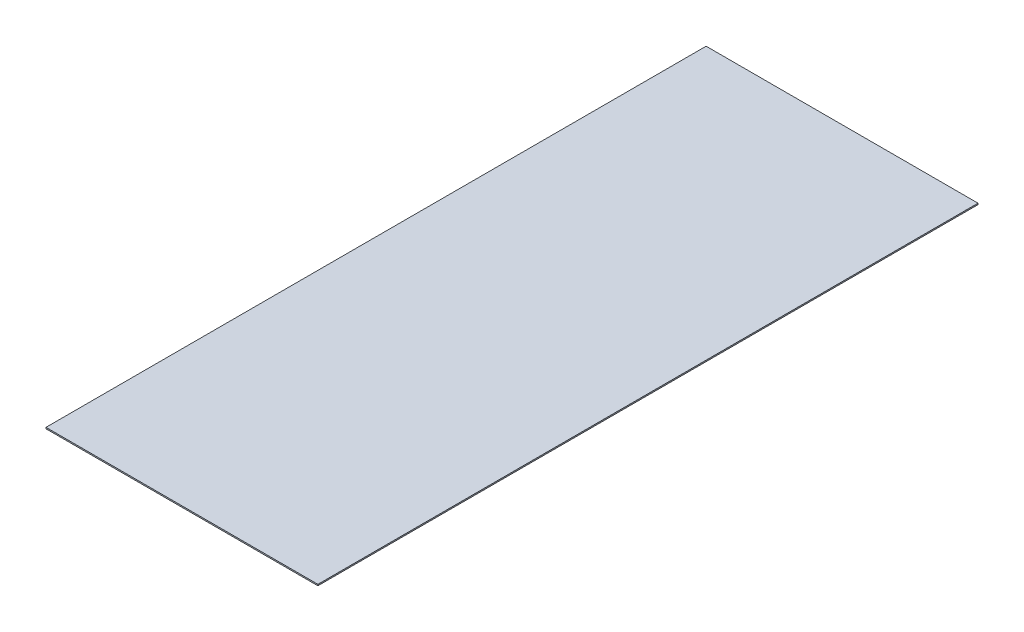
ISO-10303-21;
HEADER;
FILE_DESCRIPTION(('STEP AP214'),'2;1');
FILE_NAME('part.step','',(''),(''),'','','');
FILE_SCHEMA(('AUTOMOTIVE_DESIGN { 1 0 10303 214 1 1 1 1 }'));
ENDSEC;
DATA;
#1=APPLICATION_CONTEXT('core data for automotive mechanical design processes');
#2=APPLICATION_PROTOCOL_DEFINITION('international standard','automotive_design',2000,#1);
#3=PRODUCT_CONTEXT('',#1,'mechanical');
#4=PRODUCT('Part','Part','',(#3));
#5=PRODUCT_RELATED_PRODUCT_CATEGORY('part','',(#4));
#6=PRODUCT_DEFINITION_FORMATION('','',#4);
#7=PRODUCT_DEFINITION_CONTEXT('part definition',#1,'design');
#8=PRODUCT_DEFINITION('design','',#6,#7);
#9=PRODUCT_DEFINITION_SHAPE('','',#8);
#10=(LENGTH_UNIT() NAMED_UNIT(*) SI_UNIT(.MILLI.,.METRE.));
#11=(NAMED_UNIT(*) PLANE_ANGLE_UNIT() SI_UNIT($,.RADIAN.));
#12=(NAMED_UNIT(*) SI_UNIT($,.STERADIAN.) SOLID_ANGLE_UNIT());
#13=UNCERTAINTY_MEASURE_WITH_UNIT(LENGTH_MEASURE(1.E-05),#10,'distance_accuracy_value','');
#14=(GEOMETRIC_REPRESENTATION_CONTEXT(3) GLOBAL_UNCERTAINTY_ASSIGNED_CONTEXT((#13)) GLOBAL_UNIT_ASSIGNED_CONTEXT((#10,
#11,#12)) REPRESENTATION_CONTEXT('',''));
#15=CARTESIAN_POINT('',(0.,0.,0.));
#16=DIRECTION('',(0.,0.,1.));
#17=DIRECTION('',(1.,0.,0.));
#18=AXIS2_PLACEMENT_3D('',#15,#16,#17);
#19=CARTESIAN_POINT('',(-208.,0.999999999999988,1010.));
#20=DIRECTION('',(1.,0.,0.));
#21=DIRECTION('',(0.,0.,-1.));
#22=AXIS2_PLACEMENT_3D('',#19,#20,#21);
#23=PLANE('',#22);
#24=DIRECTION('',(0.,-1.,0.));
#25=VECTOR('',#24,1.);
#26=CARTESIAN_POINT('',(-208.,0.999999999999988,0.));
#27=LINE('',#26,#25);
#28=CARTESIAN_POINT('',(-208.,0.999999999999988,0.));
#29=VERTEX_POINT('',#28);
#30=CARTESIAN_POINT('',(-208.,-1.00000000000001,0.));
#31=VERTEX_POINT('',#30);
#32=EDGE_CURVE('E94',#29,#31,#27,.T.);
#33=ORIENTED_EDGE('',*,*,#32,.T.);
#34=DIRECTION('',(0.,0.,-1.));
#35=VECTOR('',#34,1.);
#36=CARTESIAN_POINT('',(-208.,-1.00000000000001,1010.));
#37=LINE('',#36,#35);
#38=CARTESIAN_POINT('',(-208.,-1.00000000000001,1010.));
#39=VERTEX_POINT('',#38);
#40=EDGE_CURVE('E11',#39,#31,#37,.T.);
#41=ORIENTED_EDGE('',*,*,#40,.F.);
#42=DIRECTION('',(0.,-1.,0.));
#43=VECTOR('',#42,1.);
#44=CARTESIAN_POINT('',(-208.,0.999999999999988,1010.));
#45=LINE('',#44,#43);
#46=CARTESIAN_POINT('',(-208.,0.999999999999988,1010.));
#47=VERTEX_POINT('',#46);
#48=EDGE_CURVE('E82',#47,#39,#45,.T.);
#49=ORIENTED_EDGE('',*,*,#48,.F.);
#50=DIRECTION('',(0.,0.,-1.));
#51=VECTOR('',#50,1.);
#52=CARTESIAN_POINT('',(-208.,0.999999999999988,1010.));
#53=LINE('',#52,#51);
#54=EDGE_CURVE('E90',#47,#29,#53,.T.);
#55=ORIENTED_EDGE('',*,*,#54,.T.);
#56=EDGE_LOOP('',(#33,#41,#49,#55));
#57=FACE_BOUND('',#56,.T.);
#58=ADVANCED_FACE('F31',(#57),#23,.F.);
#59=CARTESIAN_POINT('',(-208.,-1.00000000000001,1010.));
#60=DIRECTION('',(0.,1.,0.));
#61=DIRECTION('',(0.,0.,1.));
#62=AXIS2_PLACEMENT_3D('',#59,#60,#61);
#63=PLANE('',#62);
#64=DIRECTION('',(1.,0.,0.));
#65=VECTOR('',#64,1.);
#66=CARTESIAN_POINT('',(-208.,-1.00000000000001,0.));
#67=LINE('',#66,#65);
#68=CARTESIAN_POINT('',(208.,-1.00000000000001,0.));
#69=VERTEX_POINT('',#68);
#70=EDGE_CURVE('E86',#31,#69,#67,.T.);
#71=ORIENTED_EDGE('',*,*,#70,.T.);
#72=DIRECTION('',(0.,0.,-1.));
#73=VECTOR('',#72,1.);
#74=CARTESIAN_POINT('',(208.,-1.00000000000001,1010.));
#75=LINE('',#74,#73);
#76=CARTESIAN_POINT('',(208.,-1.00000000000001,1010.));
#77=VERTEX_POINT('',#76);
#78=EDGE_CURVE('E39',#77,#69,#75,.T.);
#79=ORIENTED_EDGE('',*,*,#78,.F.);
#80=DIRECTION('',(1.,0.,0.));
#81=VECTOR('',#80,1.);
#82=CARTESIAN_POINT('',(-208.,-1.00000000000001,1010.));
#83=LINE('',#82,#81);
#84=EDGE_CURVE('E77',#39,#77,#83,.T.);
#85=ORIENTED_EDGE('',*,*,#84,.F.);
#86=ORIENTED_EDGE('',*,*,#40,.T.);
#87=EDGE_LOOP('',(#71,#79,#85,#86));
#88=FACE_BOUND('',#87,.T.);
#89=ADVANCED_FACE('F85',(#88),#63,.F.);
#90=CARTESIAN_POINT('',(208.,0.999999999999988,1010.));
#91=DIRECTION('',(-1.,0.,0.));
#92=DIRECTION('',(0.,0.,1.));
#93=AXIS2_PLACEMENT_3D('',#90,#91,#92);
#94=PLANE('',#93);
#95=DIRECTION('',(0.,1.,0.));
#96=VECTOR('',#95,1.);
#97=CARTESIAN_POINT('',(208.,0.999999999999988,0.));
#98=LINE('',#97,#96);
#99=CARTESIAN_POINT('',(208.,0.999999999999988,0.));
#100=VERTEX_POINT('',#99);
#101=EDGE_CURVE('E64',#69,#100,#98,.T.);
#102=ORIENTED_EDGE('',*,*,#101,.T.);
#103=DIRECTION('',(0.,0.,-1.));
#104=VECTOR('',#103,1.);
#105=CARTESIAN_POINT('',(208.,0.999999999999988,1010.));
#106=LINE('',#105,#104);
#107=CARTESIAN_POINT('',(208.,0.999999999999988,1010.));
#108=VERTEX_POINT('',#107);
#109=EDGE_CURVE('E87',#108,#100,#106,.T.);
#110=ORIENTED_EDGE('',*,*,#109,.F.);
#111=DIRECTION('',(0.,1.,0.));
#112=VECTOR('',#111,1.);
#113=CARTESIAN_POINT('',(208.,0.999999999999988,1010.));
#114=LINE('',#113,#112);
#115=EDGE_CURVE('E80',#77,#108,#114,.T.);
#116=ORIENTED_EDGE('',*,*,#115,.F.);
#117=ORIENTED_EDGE('',*,*,#78,.T.);
#118=EDGE_LOOP('',(#102,#110,#116,#117));
#119=FACE_BOUND('',#118,.T.);
#120=ADVANCED_FACE('F88',(#119),#94,.F.);
#121=CARTESIAN_POINT('',(-208.,0.999999999999988,1010.));
#122=DIRECTION('',(0.,-1.,0.));
#123=DIRECTION('',(0.,0.,-1.));
#124=AXIS2_PLACEMENT_3D('',#121,#122,#123);
#125=PLANE('',#124);
#126=DIRECTION('',(-1.,0.,0.));
#127=VECTOR('',#126,1.);
#128=CARTESIAN_POINT('',(-208.,0.999999999999988,0.));
#129=LINE('',#128,#127);
#130=EDGE_CURVE('E70',#100,#29,#129,.T.);
#131=ORIENTED_EDGE('',*,*,#130,.T.);
#132=ORIENTED_EDGE('',*,*,#54,.F.);
#133=DIRECTION('',(-1.,0.,0.));
#134=VECTOR('',#133,1.);
#135=CARTESIAN_POINT('',(-208.,0.999999999999988,1010.));
#136=LINE('',#135,#134);
#137=EDGE_CURVE('E47',#108,#47,#136,.T.);
#138=ORIENTED_EDGE('',*,*,#137,.F.);
#139=ORIENTED_EDGE('',*,*,#109,.T.);
#140=EDGE_LOOP('',(#131,#132,#138,#139));
#141=FACE_BOUND('',#140,.T.);
#142=ADVANCED_FACE('F101',(#141),#125,.F.);
#143=CARTESIAN_POINT('',(-208.,-1.00000000000001,1010.));
#144=DIRECTION('',(0.,0.,1.));
#145=DIRECTION('',(1.,0.,0.));
#146=AXIS2_PLACEMENT_3D('',#143,#144,#145);
#147=PLANE('',#146);
#148=ORIENTED_EDGE('',*,*,#48,.T.);
#149=ORIENTED_EDGE('',*,*,#84,.T.);
#150=ORIENTED_EDGE('',*,*,#115,.T.);
#151=ORIENTED_EDGE('',*,*,#137,.T.);
#152=EDGE_LOOP('',(#148,#149,#150,#151));
#153=FACE_BOUND('',#152,.T.);
#154=ADVANCED_FACE('F78',(#153),#147,.T.);
#155=CARTESIAN_POINT('',(-208.,-1.00000000000001,0.));
#156=DIRECTION('',(0.,0.,1.));
#157=DIRECTION('',(1.,0.,0.));
#158=AXIS2_PLACEMENT_3D('',#155,#156,#157);
#159=PLANE('',#158);
#160=ORIENTED_EDGE('',*,*,#32,.F.);
#161=ORIENTED_EDGE('',*,*,#130,.F.);
#162=ORIENTED_EDGE('',*,*,#101,.F.);
#163=ORIENTED_EDGE('',*,*,#70,.F.);
#164=EDGE_LOOP('',(#160,#161,#162,#163));
#165=FACE_BOUND('',#164,.T.);
#166=ADVANCED_FACE('F104',(#165),#159,.F.);
#167=CLOSED_SHELL('',(#58,#89,#120,#142,#154,#166));
#168=MANIFOLD_SOLID_BREP('B2',#167);
#169=ADVANCED_BREP_SHAPE_REPRESENTATION('',(#18,#168),#14);
#170=SHAPE_DEFINITION_REPRESENTATION(#9,#169);
ENDSEC;
END-ISO-10303-21;
